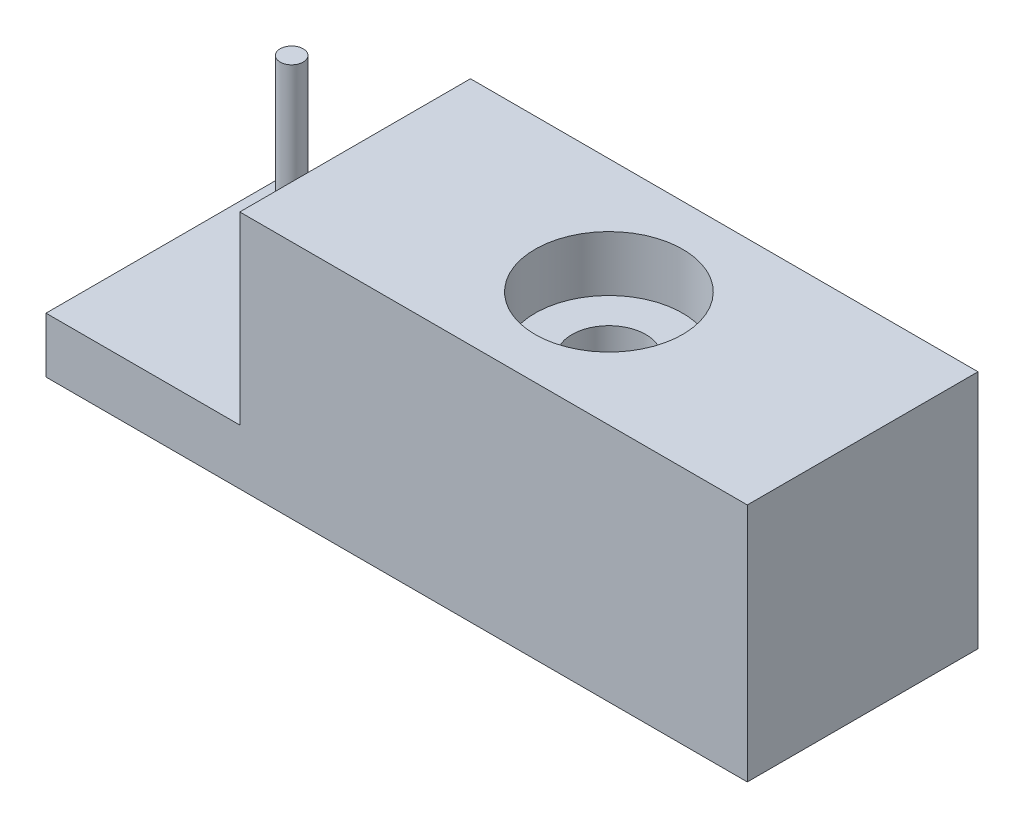
ISO-10303-21;
HEADER;
FILE_DESCRIPTION(('STEP AP214'),'2;1');
FILE_NAME('part.step','',(''),(''),'','','');
FILE_SCHEMA(('AUTOMOTIVE_DESIGN { 1 0 10303 214 1 1 1 1 }'));
ENDSEC;
DATA;
#1=APPLICATION_CONTEXT('core data for automotive mechanical design processes');
#2=APPLICATION_PROTOCOL_DEFINITION('international standard','automotive_design',2000,#1);
#3=PRODUCT_CONTEXT('',#1,'mechanical');
#4=PRODUCT('Part','Part','',(#3));
#5=PRODUCT_RELATED_PRODUCT_CATEGORY('part','',(#4));
#6=PRODUCT_DEFINITION_FORMATION('','',#4);
#7=PRODUCT_DEFINITION_CONTEXT('part definition',#1,'design');
#8=PRODUCT_DEFINITION('design','',#6,#7);
#9=PRODUCT_DEFINITION_SHAPE('','',#8);
#10=(LENGTH_UNIT() NAMED_UNIT(*) SI_UNIT(.MILLI.,.METRE.));
#11=(NAMED_UNIT(*) PLANE_ANGLE_UNIT() SI_UNIT($,.RADIAN.));
#12=(NAMED_UNIT(*) SI_UNIT($,.STERADIAN.) SOLID_ANGLE_UNIT());
#13=UNCERTAINTY_MEASURE_WITH_UNIT(LENGTH_MEASURE(1.E-05),#10,'distance_accuracy_value','');
#14=(GEOMETRIC_REPRESENTATION_CONTEXT(3) GLOBAL_UNCERTAINTY_ASSIGNED_CONTEXT((#13)) GLOBAL_UNIT_ASSIGNED_CONTEXT((#10,
#11,#12)) REPRESENTATION_CONTEXT('',''));
#15=CARTESIAN_POINT('',(0.,0.,0.));
#16=DIRECTION('',(0.,0.,1.));
#17=DIRECTION('',(1.,0.,0.));
#18=AXIS2_PLACEMENT_3D('',#15,#16,#17);
#19=CARTESIAN_POINT('',(0.,52.,-50.));
#20=DIRECTION('',(-1.,0.,0.));
#21=DIRECTION('',(0.,0.,1.));
#22=AXIS2_PLACEMENT_3D('',#19,#20,#21);
#23=PLANE('',#22);
#24=DIRECTION('',(0.,0.,1.));
#25=VECTOR('',#24,1.);
#26=CARTESIAN_POINT('',(0.,12.,-50.));
#27=LINE('',#26,#25);
#28=CARTESIAN_POINT('',(0.,12.,-50.));
#29=VERTEX_POINT('',#28);
#30=CARTESIAN_POINT('',(0.,12.,0.));
#31=VERTEX_POINT('',#30);
#32=EDGE_CURVE('E54',#29,#31,#27,.T.);
#33=ORIENTED_EDGE('',*,*,#32,.F.);
#34=DIRECTION('',(0.,-1.,0.));
#35=VECTOR('',#34,1.);
#36=CARTESIAN_POINT('',(0.,52.,-50.));
#37=LINE('',#36,#35);
#38=CARTESIAN_POINT('',(0.,0.,-50.));
#39=VERTEX_POINT('',#38);
#40=EDGE_CURVE('E83',#29,#39,#37,.T.);
#41=ORIENTED_EDGE('',*,*,#40,.T.);
#42=DIRECTION('',(0.,0.,1.));
#43=VECTOR('',#42,1.);
#44=CARTESIAN_POINT('',(0.,0.,-50.));
#45=LINE('',#44,#43);
#46=CARTESIAN_POINT('',(0.,0.,0.));
#47=VERTEX_POINT('',#46);
#48=EDGE_CURVE('E135',#39,#47,#45,.T.);
#49=ORIENTED_EDGE('',*,*,#48,.T.);
#50=DIRECTION('',(0.,-1.,0.));
#51=VECTOR('',#50,1.);
#52=CARTESIAN_POINT('',(0.,52.,0.));
#53=LINE('',#52,#51);
#54=EDGE_CURVE('E110',#31,#47,#53,.T.);
#55=ORIENTED_EDGE('',*,*,#54,.F.);
#56=EDGE_LOOP('',(#33,#41,#49,#55));
#57=FACE_BOUND('',#56,.T.);
#58=ADVANCED_FACE('F39',(#57),#23,.T.);
#59=CARTESIAN_POINT('',(152.,52.,-50.));
#60=DIRECTION('',(0.,1.,0.));
#61=DIRECTION('',(0.,0.,1.));
#62=AXIS2_PLACEMENT_3D('',#59,#60,#61);
#63=PLANE('',#62);
#64=CARTESIAN_POINT('',(97.,52.,-25.));
#65=DIRECTION('',(0.,1.,0.));
#66=DIRECTION('',(0.,0.,1.));
#67=AXIS2_PLACEMENT_3D('',#64,#65,#66);
#68=CIRCLE('',#67,16.);
#69=CARTESIAN_POINT('',(97.,52.,-9.00000000000001));
#70=VERTEX_POINT('',#69);
#71=EDGE_CURVE('E174',#70,#70,#68,.T.);
#72=ORIENTED_EDGE('',*,*,#71,.F.);
#73=EDGE_LOOP('',(#72));
#74=FACE_BOUND('',#73,.T.);
#75=DIRECTION('',(0.,0.,1.));
#76=VECTOR('',#75,1.);
#77=CARTESIAN_POINT('',(42.,52.,-50.));
#78=LINE('',#77,#76);
#79=CARTESIAN_POINT('',(42.,52.,-50.));
#80=VERTEX_POINT('',#79);
#81=CARTESIAN_POINT('',(42.,52.,0.));
#82=VERTEX_POINT('',#81);
#83=EDGE_CURVE('E139',#80,#82,#78,.T.);
#84=ORIENTED_EDGE('',*,*,#83,.T.);
#85=DIRECTION('',(-1.,0.,0.));
#86=VECTOR('',#85,1.);
#87=CARTESIAN_POINT('',(152.,52.,0.));
#88=LINE('',#87,#86);
#89=CARTESIAN_POINT('',(152.,52.,0.));
#90=VERTEX_POINT('',#89);
#91=EDGE_CURVE('E119',#90,#82,#88,.T.);
#92=ORIENTED_EDGE('',*,*,#91,.F.);
#93=DIRECTION('',(0.,0.,1.));
#94=VECTOR('',#93,1.);
#95=CARTESIAN_POINT('',(152.,52.,-50.));
#96=LINE('',#95,#94);
#97=CARTESIAN_POINT('',(152.,52.,-50.));
#98=VERTEX_POINT('',#97);
#99=EDGE_CURVE('E47',#98,#90,#96,.T.);
#100=ORIENTED_EDGE('',*,*,#99,.F.);
#101=DIRECTION('',(-1.,0.,0.));
#102=VECTOR('',#101,1.);
#103=CARTESIAN_POINT('',(152.,52.,-50.));
#104=LINE('',#103,#102);
#105=EDGE_CURVE('E132',#98,#80,#104,.T.);
#106=ORIENTED_EDGE('',*,*,#105,.T.);
#107=EDGE_LOOP('',(#84,#92,#100,#106));
#108=FACE_BOUND('',#107,.T.);
#109=ADVANCED_FACE('F198',(#74,#108),#63,.T.);
#110=CARTESIAN_POINT('',(152.,0.,-50.));
#111=DIRECTION('',(1.,0.,0.));
#112=DIRECTION('',(0.,0.,-1.));
#113=AXIS2_PLACEMENT_3D('',#110,#111,#112);
#114=PLANE('',#113);
#115=DIRECTION('',(0.,1.,0.));
#116=VECTOR('',#115,1.);
#117=CARTESIAN_POINT('',(152.,0.,0.));
#118=LINE('',#117,#116);
#119=CARTESIAN_POINT('',(152.,0.,0.));
#120=VERTEX_POINT('',#119);
#121=EDGE_CURVE('E126',#120,#90,#118,.T.);
#122=ORIENTED_EDGE('',*,*,#121,.F.);
#123=DIRECTION('',(0.,0.,1.));
#124=VECTOR('',#123,1.);
#125=CARTESIAN_POINT('',(152.,0.,-50.));
#126=LINE('',#125,#124);
#127=CARTESIAN_POINT('',(152.,0.,-50.));
#128=VERTEX_POINT('',#127);
#129=EDGE_CURVE('E147',#128,#120,#126,.T.);
#130=ORIENTED_EDGE('',*,*,#129,.F.);
#131=DIRECTION('',(0.,1.,0.));
#132=VECTOR('',#131,1.);
#133=CARTESIAN_POINT('',(152.,0.,-50.));
#134=LINE('',#133,#132);
#135=EDGE_CURVE('E123',#128,#98,#134,.T.);
#136=ORIENTED_EDGE('',*,*,#135,.T.);
#137=ORIENTED_EDGE('',*,*,#99,.T.);
#138=EDGE_LOOP('',(#122,#130,#136,#137));
#139=FACE_BOUND('',#138,.T.);
#140=ADVANCED_FACE('F203',(#139),#114,.T.);
#141=CARTESIAN_POINT('',(0.,0.,-50.));
#142=DIRECTION('',(0.,-1.,0.));
#143=DIRECTION('',(0.,0.,-1.));
#144=AXIS2_PLACEMENT_3D('',#141,#142,#143);
#145=PLANE('',#144);
#146=CARTESIAN_POINT('',(97.,0.,-25.));
#147=DIRECTION('',(0.,1.,0.));
#148=DIRECTION('',(0.,0.,1.));
#149=AXIS2_PLACEMENT_3D('',#146,#147,#148);
#150=CIRCLE('',#149,16.);
#151=CARTESIAN_POINT('',(97.,0.,-9.00000000000001));
#152=VERTEX_POINT('',#151);
#153=EDGE_CURVE('E154',#152,#152,#150,.T.);
#154=ORIENTED_EDGE('',*,*,#153,.T.);
#155=EDGE_LOOP('',(#154));
#156=FACE_BOUND('',#155,.T.);
#157=DIRECTION('',(1.,0.,0.));
#158=VECTOR('',#157,1.);
#159=CARTESIAN_POINT('',(0.,0.,0.));
#160=LINE('',#159,#158);
#161=EDGE_CURVE('E138',#47,#120,#160,.T.);
#162=ORIENTED_EDGE('',*,*,#161,.F.);
#163=ORIENTED_EDGE('',*,*,#48,.F.);
#164=DIRECTION('',(1.,0.,0.));
#165=VECTOR('',#164,1.);
#166=CARTESIAN_POINT('',(0.,0.,-50.));
#167=LINE('',#166,#165);
#168=EDGE_CURVE('E117',#39,#128,#167,.T.);
#169=ORIENTED_EDGE('',*,*,#168,.T.);
#170=ORIENTED_EDGE('',*,*,#129,.T.);
#171=EDGE_LOOP('',(#162,#163,#169,#170));
#172=FACE_BOUND('',#171,.T.);
#173=ADVANCED_FACE('F202',(#156,#172),#145,.T.);
#174=CARTESIAN_POINT('',(0.,0.,-50.));
#175=DIRECTION('',(0.,0.,1.));
#176=DIRECTION('',(1.,0.,0.));
#177=AXIS2_PLACEMENT_3D('',#174,#175,#176);
#178=PLANE('',#177);
#179=DIRECTION('',(1.,0.,0.));
#180=VECTOR('',#179,1.);
#181=CARTESIAN_POINT('',(0.,12.,-50.));
#182=LINE('',#181,#180);
#183=CARTESIAN_POINT('',(42.,12.,-50.));
#184=VERTEX_POINT('',#183);
#185=EDGE_CURVE('E99',#29,#184,#182,.T.);
#186=ORIENTED_EDGE('',*,*,#185,.T.);
#187=DIRECTION('',(0.,1.,0.));
#188=VECTOR('',#187,1.);
#189=CARTESIAN_POINT('',(42.,12.,-50.));
#190=LINE('',#189,#188);
#191=EDGE_CURVE('E106',#184,#80,#190,.T.);
#192=ORIENTED_EDGE('',*,*,#191,.T.);
#193=ORIENTED_EDGE('',*,*,#105,.F.);
#194=ORIENTED_EDGE('',*,*,#135,.F.);
#195=ORIENTED_EDGE('',*,*,#168,.F.);
#196=ORIENTED_EDGE('',*,*,#40,.F.);
#197=EDGE_LOOP('',(#186,#192,#193,#194,#195,#196));
#198=FACE_BOUND('',#197,.T.);
#199=ADVANCED_FACE('F114',(#198),#178,.F.);
#200=CARTESIAN_POINT('',(0.,0.,0.));
#201=DIRECTION('',(0.,0.,1.));
#202=DIRECTION('',(1.,0.,0.));
#203=AXIS2_PLACEMENT_3D('',#200,#201,#202);
#204=PLANE('',#203);
#205=DIRECTION('',(0.,1.,0.));
#206=VECTOR('',#205,1.);
#207=CARTESIAN_POINT('',(42.,12.,0.));
#208=LINE('',#207,#206);
#209=CARTESIAN_POINT('',(42.,12.,0.));
#210=VERTEX_POINT('',#209);
#211=EDGE_CURVE('E107',#210,#82,#208,.T.);
#212=ORIENTED_EDGE('',*,*,#211,.F.);
#213=DIRECTION('',(1.,0.,0.));
#214=VECTOR('',#213,1.);
#215=CARTESIAN_POINT('',(0.,12.,0.));
#216=LINE('',#215,#214);
#217=EDGE_CURVE('E180',#31,#210,#216,.T.);
#218=ORIENTED_EDGE('',*,*,#217,.F.);
#219=ORIENTED_EDGE('',*,*,#54,.T.);
#220=ORIENTED_EDGE('',*,*,#161,.T.);
#221=ORIENTED_EDGE('',*,*,#121,.T.);
#222=ORIENTED_EDGE('',*,*,#91,.T.);
#223=EDGE_LOOP('',(#212,#218,#219,#220,#221,#222));
#224=FACE_BOUND('',#223,.T.);
#225=ADVANCED_FACE('F197',(#224),#204,.T.);
#226=CARTESIAN_POINT('',(42.,12.,-50.));
#227=DIRECTION('',(1.,0.,0.));
#228=DIRECTION('',(0.,1.,0.));
#229=AXIS2_PLACEMENT_3D('',#226,#227,#228);
#230=PLANE('',#229);
#231=ORIENTED_EDGE('',*,*,#211,.T.);
#232=ORIENTED_EDGE('',*,*,#83,.F.);
#233=ORIENTED_EDGE('',*,*,#191,.F.);
#234=DIRECTION('',(0.,0.,1.));
#235=VECTOR('',#234,1.);
#236=CARTESIAN_POINT('',(42.,12.,-50.));
#237=LINE('',#236,#235);
#238=EDGE_CURVE('E101',#184,#210,#237,.T.);
#239=ORIENTED_EDGE('',*,*,#238,.T.);
#240=EDGE_LOOP('',(#231,#232,#233,#239));
#241=FACE_BOUND('',#240,.T.);
#242=ADVANCED_FACE('F194',(#241),#230,.F.);
#243=CARTESIAN_POINT('',(0.,12.,-50.));
#244=DIRECTION('',(0.,-1.,0.));
#245=DIRECTION('',(0.,0.,-1.));
#246=AXIS2_PLACEMENT_3D('',#243,#244,#245);
#247=PLANE('',#246);
#248=CARTESIAN_POINT('',(28.25,12.,-25.));
#249=DIRECTION('',(0.,-1.,0.));
#250=DIRECTION('',(0.,0.,-1.));
#251=AXIS2_PLACEMENT_3D('',#248,#249,#250);
#252=CIRCLE('',#251,2.5);
#253=CARTESIAN_POINT('',(28.25,12.,-27.5));
#254=VERTEX_POINT('',#253);
#255=EDGE_CURVE('E11',#254,#254,#252,.F.);
#256=ORIENTED_EDGE('',*,*,#255,.F.);
#257=EDGE_LOOP('',(#256));
#258=FACE_BOUND('',#257,.T.);
#259=ORIENTED_EDGE('',*,*,#217,.T.);
#260=ORIENTED_EDGE('',*,*,#238,.F.);
#261=ORIENTED_EDGE('',*,*,#185,.F.);
#262=ORIENTED_EDGE('',*,*,#32,.T.);
#263=EDGE_LOOP('',(#259,#260,#261,#262));
#264=FACE_BOUND('',#263,.T.);
#265=ADVANCED_FACE('F100',(#258,#264),#247,.F.);
#266=CARTESIAN_POINT('',(97.,40.,-25.));
#267=DIRECTION('',(0.,1.,0.));
#268=DIRECTION('',(0.,0.,1.));
#269=AXIS2_PLACEMENT_3D('',#266,#267,#268);
#270=CYLINDRICAL_SURFACE('',#269,16.);
#271=CARTESIAN_POINT('',(97.,40.,-25.));
#272=DIRECTION('',(0.,1.,0.));
#273=DIRECTION('',(0.,0.,1.));
#274=AXIS2_PLACEMENT_3D('',#271,#272,#273);
#275=CIRCLE('',#274,16.);
#276=CARTESIAN_POINT('',(97.,40.,-9.00000000000001));
#277=VERTEX_POINT('',#276);
#278=EDGE_CURVE('E176',#277,#277,#275,.T.);
#279=ORIENTED_EDGE('',*,*,#278,.F.);
#280=EDGE_LOOP('',(#279));
#281=FACE_BOUND('',#280,.T.);
#282=ORIENTED_EDGE('',*,*,#71,.T.);
#283=EDGE_LOOP('',(#282));
#284=FACE_BOUND('',#283,.T.);
#285=ADVANCED_FACE('F232',(#281,#284),#270,.F.);
#286=CARTESIAN_POINT('',(97.,40.,-25.));
#287=DIRECTION('',(0.,1.,0.));
#288=DIRECTION('',(0.,0.,1.));
#289=AXIS2_PLACEMENT_3D('',#286,#287,#288);
#290=PLANE('',#289);
#291=CARTESIAN_POINT('',(97.,40.,-25.));
#292=DIRECTION('',(0.,1.,0.));
#293=DIRECTION('',(0.,0.,1.));
#294=AXIS2_PLACEMENT_3D('',#291,#292,#293);
#295=CIRCLE('',#294,8.00000000000001);
#296=CARTESIAN_POINT('',(97.,40.,-17.));
#297=VERTEX_POINT('',#296);
#298=EDGE_CURVE('E155',#297,#297,#295,.T.);
#299=ORIENTED_EDGE('',*,*,#298,.F.);
#300=EDGE_LOOP('',(#299));
#301=FACE_BOUND('',#300,.T.);
#302=ORIENTED_EDGE('',*,*,#278,.T.);
#303=EDGE_LOOP('',(#302));
#304=FACE_BOUND('',#303,.T.);
#305=ADVANCED_FACE('F237',(#301,#304),#290,.T.);
#306=CARTESIAN_POINT('',(97.,12.,-25.));
#307=DIRECTION('',(0.,-1.,0.));
#308=DIRECTION('',(0.,0.,-1.));
#309=AXIS2_PLACEMENT_3D('',#306,#307,#308);
#310=CYLINDRICAL_SURFACE('',#309,16.);
#311=CARTESIAN_POINT('',(97.,12.,-25.));
#312=DIRECTION('',(0.,1.,0.));
#313=DIRECTION('',(0.,0.,1.));
#314=AXIS2_PLACEMENT_3D('',#311,#312,#313);
#315=CIRCLE('',#314,16.);
#316=CARTESIAN_POINT('',(97.,12.,-9.00000000000001));
#317=VERTEX_POINT('',#316);
#318=EDGE_CURVE('E161',#317,#317,#315,.T.);
#319=ORIENTED_EDGE('',*,*,#318,.T.);
#320=EDGE_LOOP('',(#319));
#321=FACE_BOUND('',#320,.T.);
#322=ORIENTED_EDGE('',*,*,#153,.F.);
#323=EDGE_LOOP('',(#322));
#324=FACE_BOUND('',#323,.T.);
#325=ADVANCED_FACE('F255',(#321,#324),#310,.F.);
#326=CARTESIAN_POINT('',(97.,12.,-25.));
#327=DIRECTION('',(0.,-1.,0.));
#328=DIRECTION('',(0.,0.,1.));
#329=AXIS2_PLACEMENT_3D('',#326,#327,#328);
#330=PLANE('',#329);
#331=CARTESIAN_POINT('',(97.,12.,-25.));
#332=DIRECTION('',(0.,-1.,0.));
#333=DIRECTION('',(0.,0.,-1.));
#334=AXIS2_PLACEMENT_3D('',#331,#332,#333);
#335=CIRCLE('',#334,8.00000000000001);
#336=CARTESIAN_POINT('',(97.,12.,-33.));
#337=VERTEX_POINT('',#336);
#338=EDGE_CURVE('E151',#337,#337,#335,.T.);
#339=ORIENTED_EDGE('',*,*,#338,.F.);
#340=EDGE_LOOP('',(#339));
#341=FACE_BOUND('',#340,.T.);
#342=ORIENTED_EDGE('',*,*,#318,.F.);
#343=EDGE_LOOP('',(#342));
#344=FACE_BOUND('',#343,.T.);
#345=ADVANCED_FACE('F260',(#341,#344),#330,.T.);
#346=CARTESIAN_POINT('',(97.,0.,-25.));
#347=DIRECTION('',(0.,1.,0.));
#348=DIRECTION('',(0.,0.,1.));
#349=AXIS2_PLACEMENT_3D('',#346,#347,#348);
#350=CYLINDRICAL_SURFACE('',#349,8.00000000000001);
#351=ORIENTED_EDGE('',*,*,#338,.T.);
#352=EDGE_LOOP('',(#351));
#353=FACE_BOUND('',#352,.T.);
#354=ORIENTED_EDGE('',*,*,#298,.T.);
#355=EDGE_LOOP('',(#354));
#356=FACE_BOUND('',#355,.T.);
#357=ADVANCED_FACE('F277',(#353,#356),#350,.F.);
#358=CARTESIAN_POINT('',(28.25,62.,-25.));
#359=DIRECTION('',(0.,-1.,0.));
#360=DIRECTION('',(0.,0.,-1.));
#361=AXIS2_PLACEMENT_3D('',#358,#359,#360);
#362=CYLINDRICAL_SURFACE('',#361,2.5);
#363=CARTESIAN_POINT('',(28.25,62.,-25.));
#364=DIRECTION('',(0.,1.,0.));
#365=DIRECTION('',(0.,0.,1.));
#366=AXIS2_PLACEMENT_3D('',#363,#364,#365);
#367=CIRCLE('',#366,2.5);
#368=CARTESIAN_POINT('',(28.25,62.,-22.5));
#369=VERTEX_POINT('',#368);
#370=EDGE_CURVE('E164',#369,#369,#367,.T.);
#371=ORIENTED_EDGE('',*,*,#370,.F.);
#372=EDGE_LOOP('',(#371));
#373=FACE_BOUND('',#372,.T.);
#374=ORIENTED_EDGE('',*,*,#255,.T.);
#375=EDGE_LOOP('',(#374));
#376=FACE_BOUND('',#375,.T.);
#377=ADVANCED_FACE('F287',(#373,#376),#362,.T.);
#378=CARTESIAN_POINT('',(28.25,62.,-25.));
#379=DIRECTION('',(0.,1.,0.));
#380=DIRECTION('',(0.,0.,1.));
#381=AXIS2_PLACEMENT_3D('',#378,#379,#380);
#382=PLANE('',#381);
#383=ORIENTED_EDGE('',*,*,#370,.T.);
#384=EDGE_LOOP('',(#383));
#385=FACE_BOUND('',#384,.T.);
#386=ADVANCED_FACE('F303',(#385),#382,.T.);
#387=CLOSED_SHELL('',(#58,#109,#140,#173,#199,#225,#242,#265,#285,#305,#325,#345,#357,#377,#386));
#388=MANIFOLD_SOLID_BREP('B2',#387);
#389=ADVANCED_BREP_SHAPE_REPRESENTATION('',(#18,#388),#14);
#390=SHAPE_DEFINITION_REPRESENTATION(#9,#389);
ENDSEC;
END-ISO-10303-21;
